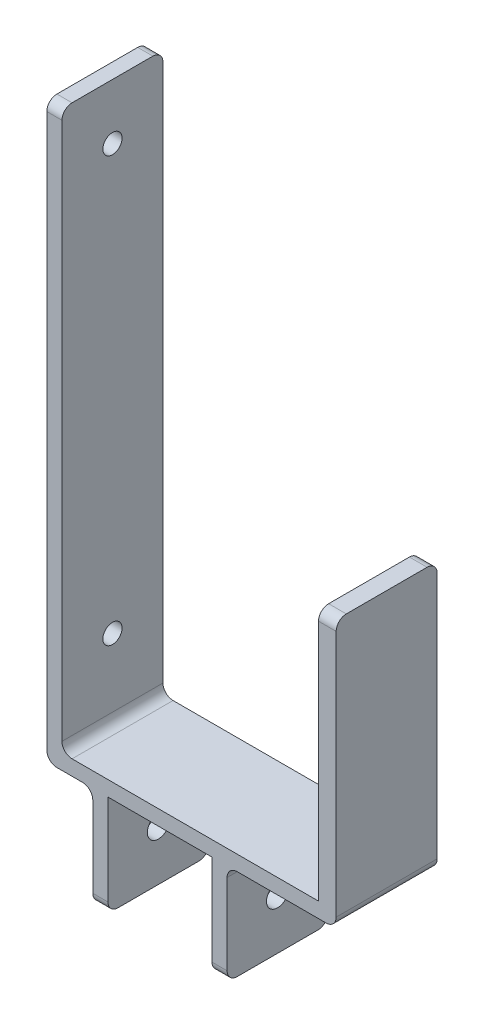
ISO-10303-21;
HEADER;
FILE_DESCRIPTION(('STEP AP214'),'2;1');
FILE_NAME('part.step','',(''),(''),'','','');
FILE_SCHEMA(('AUTOMOTIVE_DESIGN { 1 0 10303 214 1 1 1 1 }'));
ENDSEC;
DATA;
#1=APPLICATION_CONTEXT('core data for automotive mechanical design processes');
#2=APPLICATION_PROTOCOL_DEFINITION('international standard','automotive_design',2000,#1);
#3=PRODUCT_CONTEXT('',#1,'mechanical');
#4=PRODUCT('Part','Part','',(#3));
#5=PRODUCT_RELATED_PRODUCT_CATEGORY('part','',(#4));
#6=PRODUCT_DEFINITION_FORMATION('','',#4);
#7=PRODUCT_DEFINITION_CONTEXT('part definition',#1,'design');
#8=PRODUCT_DEFINITION('design','',#6,#7);
#9=PRODUCT_DEFINITION_SHAPE('','',#8);
#10=(LENGTH_UNIT() NAMED_UNIT(*) SI_UNIT(.MILLI.,.METRE.));
#11=(NAMED_UNIT(*) PLANE_ANGLE_UNIT() SI_UNIT($,.RADIAN.));
#12=(NAMED_UNIT(*) SI_UNIT($,.STERADIAN.) SOLID_ANGLE_UNIT());
#13=UNCERTAINTY_MEASURE_WITH_UNIT(LENGTH_MEASURE(1.E-05),#10,'distance_accuracy_value','');
#14=(GEOMETRIC_REPRESENTATION_CONTEXT(3) GLOBAL_UNCERTAINTY_ASSIGNED_CONTEXT((#13)) GLOBAL_UNIT_ASSIGNED_CONTEXT((#10,
#11,#12)) REPRESENTATION_CONTEXT('',''));
#15=CARTESIAN_POINT('',(0.,0.,0.));
#16=DIRECTION('',(0.,0.,1.));
#17=DIRECTION('',(1.,0.,0.));
#18=AXIS2_PLACEMENT_3D('',#15,#16,#17);
#19=CARTESIAN_POINT('',(-25.4,110.5,20.));
#20=DIRECTION('',(-1.,0.,0.));
#21=DIRECTION('',(0.,-1.,0.));
#22=AXIS2_PLACEMENT_3D('',#19,#20,#21);
#23=PLANE('',#22);
#24=CARTESIAN_POINT('',(-25.4,15.5,10.));
#25=DIRECTION('',(-1.,0.,0.));
#26=DIRECTION('',(0.,-1.,0.));
#27=AXIS2_PLACEMENT_3D('',#24,#25,#26);
#28=CIRCLE('',#27,1.9);
#29=CARTESIAN_POINT('',(-25.4,13.6,10.));
#30=VERTEX_POINT('',#29);
#31=EDGE_CURVE('E630',#30,#30,#28,.T.);
#32=ORIENTED_EDGE('',*,*,#31,.T.);
#33=EDGE_LOOP('',(#32));
#34=FACE_BOUND('',#33,.T.);
#35=CARTESIAN_POINT('',(-25.4,99.5,10.));
#36=DIRECTION('',(-1.,0.,0.));
#37=DIRECTION('',(0.,-1.,0.));
#38=AXIS2_PLACEMENT_3D('',#35,#36,#37);
#39=CIRCLE('',#38,1.9);
#40=CARTESIAN_POINT('',(-25.4,97.6,10.));
#41=VERTEX_POINT('',#40);
#42=EDGE_CURVE('E276',#41,#41,#39,.T.);
#43=ORIENTED_EDGE('',*,*,#42,.T.);
#44=EDGE_LOOP('',(#43));
#45=FACE_BOUND('',#44,.T.);
#46=DIRECTION('',(0.,1.,0.));
#47=VECTOR('',#46,1.);
#48=CARTESIAN_POINT('',(-25.4,110.5,20.));
#49=LINE('',#48,#47);
#50=CARTESIAN_POINT('',(-25.4,2.,20.));
#51=VERTEX_POINT('',#50);
#52=CARTESIAN_POINT('',(-25.4,108.5,20.));
#53=VERTEX_POINT('',#52);
#54=EDGE_CURVE('E305',#51,#53,#49,.T.);
#55=ORIENTED_EDGE('',*,*,#54,.F.);
#56=DIRECTION('',(0.,0.,-1.));
#57=VECTOR('',#56,1.);
#58=CARTESIAN_POINT('',(-25.4,2.,0.));
#59=LINE('',#58,#57);
#60=CARTESIAN_POINT('',(-25.4,2.,0.));
#61=VERTEX_POINT('',#60);
#62=EDGE_CURVE('E414',#51,#61,#59,.T.);
#63=ORIENTED_EDGE('',*,*,#62,.T.);
#64=DIRECTION('',(0.,1.,0.));
#65=VECTOR('',#64,1.);
#66=CARTESIAN_POINT('',(-25.4,110.5,0.));
#67=LINE('',#66,#65);
#68=CARTESIAN_POINT('',(-25.4,108.5,0.));
#69=VERTEX_POINT('',#68);
#70=EDGE_CURVE('E272',#61,#69,#67,.T.);
#71=ORIENTED_EDGE('',*,*,#70,.T.);
#72=CARTESIAN_POINT('',(-25.4,108.5,2.));
#73=DIRECTION('',(-1.,0.,0.));
#74=DIRECTION('',(0.,-1.,0.));
#75=AXIS2_PLACEMENT_3D('',#72,#73,#74);
#76=CIRCLE('',#75,2.);
#77=CARTESIAN_POINT('',(-25.4,110.5,2.));
#78=VERTEX_POINT('',#77);
#79=EDGE_CURVE('E412',#69,#78,#76,.F.);
#80=ORIENTED_EDGE('',*,*,#79,.T.);
#81=DIRECTION('',(0.,0.,-1.));
#82=VECTOR('',#81,1.);
#83=CARTESIAN_POINT('',(-25.4,110.5,20.));
#84=LINE('',#83,#82);
#85=CARTESIAN_POINT('',(-25.4,110.5,18.));
#86=VERTEX_POINT('',#85);
#87=EDGE_CURVE('E327',#86,#78,#84,.T.);
#88=ORIENTED_EDGE('',*,*,#87,.F.);
#89=CARTESIAN_POINT('',(-25.4,108.5,18.));
#90=DIRECTION('',(-1.,0.,0.));
#91=DIRECTION('',(0.,-1.,0.));
#92=AXIS2_PLACEMENT_3D('',#89,#90,#91);
#93=CIRCLE('',#92,2.);
#94=EDGE_CURVE('E410',#86,#53,#93,.F.);
#95=ORIENTED_EDGE('',*,*,#94,.T.);
#96=EDGE_LOOP('',(#55,#63,#71,#80,#88,#95));
#97=FACE_BOUND('',#96,.T.);
#98=ADVANCED_FACE('F32',(#34,#45,#97),#23,.F.);
#99=CARTESIAN_POINT('',(-28.4,110.5,20.));
#100=DIRECTION('',(0.,-1.,0.));
#101=DIRECTION('',(0.,0.,-1.));
#102=AXIS2_PLACEMENT_3D('',#99,#100,#101);
#103=PLANE('',#102);
#104=ORIENTED_EDGE('',*,*,#87,.T.);
#105=DIRECTION('',(-1.,0.,0.));
#106=VECTOR('',#105,1.);
#107=CARTESIAN_POINT('',(-28.4,110.5,2.));
#108=LINE('',#107,#106);
#109=CARTESIAN_POINT('',(-28.4,110.5,2.));
#110=VERTEX_POINT('',#109);
#111=EDGE_CURVE('E427',#78,#110,#108,.T.);
#112=ORIENTED_EDGE('',*,*,#111,.T.);
#113=DIRECTION('',(0.,0.,-1.));
#114=VECTOR('',#113,1.);
#115=CARTESIAN_POINT('',(-28.4,110.5,20.));
#116=LINE('',#115,#114);
#117=CARTESIAN_POINT('',(-28.4,110.5,18.));
#118=VERTEX_POINT('',#117);
#119=EDGE_CURVE('E324',#118,#110,#116,.T.);
#120=ORIENTED_EDGE('',*,*,#119,.F.);
#121=DIRECTION('',(-1.,0.,0.));
#122=VECTOR('',#121,1.);
#123=CARTESIAN_POINT('',(-25.4,110.5,18.));
#124=LINE('',#123,#122);
#125=EDGE_CURVE('E425',#118,#86,#124,.F.);
#126=ORIENTED_EDGE('',*,*,#125,.T.);
#127=EDGE_LOOP('',(#104,#112,#120,#126));
#128=FACE_BOUND('',#127,.T.);
#129=ADVANCED_FACE('F544',(#128),#103,.F.);
#130=CARTESIAN_POINT('',(-28.4,-3.00000000000001,20.));
#131=DIRECTION('',(1.,0.,0.));
#132=DIRECTION('',(0.,1.,0.));
#133=AXIS2_PLACEMENT_3D('',#130,#131,#132);
#134=PLANE('',#133);
#135=CARTESIAN_POINT('',(-28.4,15.5,10.));
#136=DIRECTION('',(-1.,0.,0.));
#137=DIRECTION('',(0.,-1.,0.));
#138=AXIS2_PLACEMENT_3D('',#135,#136,#137);
#139=CIRCLE('',#138,1.9);
#140=CARTESIAN_POINT('',(-28.4,13.6,10.));
#141=VERTEX_POINT('',#140);
#142=EDGE_CURVE('E625',#141,#141,#139,.T.);
#143=ORIENTED_EDGE('',*,*,#142,.F.);
#144=EDGE_LOOP('',(#143));
#145=FACE_BOUND('',#144,.T.);
#146=CARTESIAN_POINT('',(-28.4,99.5,10.));
#147=DIRECTION('',(-1.,0.,0.));
#148=DIRECTION('',(0.,-1.,0.));
#149=AXIS2_PLACEMENT_3D('',#146,#147,#148);
#150=CIRCLE('',#149,1.9);
#151=CARTESIAN_POINT('',(-28.4,97.6,10.));
#152=VERTEX_POINT('',#151);
#153=EDGE_CURVE('E628',#152,#152,#150,.T.);
#154=ORIENTED_EDGE('',*,*,#153,.F.);
#155=EDGE_LOOP('',(#154));
#156=FACE_BOUND('',#155,.T.);
#157=DIRECTION('',(0.,-1.,0.));
#158=VECTOR('',#157,1.);
#159=CARTESIAN_POINT('',(-28.4,-3.00000000000001,0.));
#160=LINE('',#159,#158);
#161=CARTESIAN_POINT('',(-28.4,108.5,0.));
#162=VERTEX_POINT('',#161);
#163=CARTESIAN_POINT('',(-28.4,-1.00000000000001,0.));
#164=VERTEX_POINT('',#163);
#165=EDGE_CURVE('E275',#162,#164,#160,.T.);
#166=ORIENTED_EDGE('',*,*,#165,.T.);
#167=DIRECTION('',(0.,0.,-1.));
#168=VECTOR('',#167,1.);
#169=CARTESIAN_POINT('',(-28.4,-1.00000000000001,20.));
#170=LINE('',#169,#168);
#171=CARTESIAN_POINT('',(-28.4,-1.00000000000001,20.));
#172=VERTEX_POINT('',#171);
#173=EDGE_CURVE('E408',#164,#172,#170,.F.);
#174=ORIENTED_EDGE('',*,*,#173,.T.);
#175=DIRECTION('',(0.,-1.,0.));
#176=VECTOR('',#175,1.);
#177=CARTESIAN_POINT('',(-28.4,-3.00000000000001,20.));
#178=LINE('',#177,#176);
#179=CARTESIAN_POINT('',(-28.4,108.5,20.));
#180=VERTEX_POINT('',#179);
#181=EDGE_CURVE('E459',#180,#172,#178,.T.);
#182=ORIENTED_EDGE('',*,*,#181,.F.);
#183=CARTESIAN_POINT('',(-28.4,108.5,18.));
#184=DIRECTION('',(1.,0.,0.));
#185=DIRECTION('',(0.,1.,0.));
#186=AXIS2_PLACEMENT_3D('',#183,#184,#185);
#187=CIRCLE('',#186,2.);
#188=EDGE_CURVE('E404',#180,#118,#187,.F.);
#189=ORIENTED_EDGE('',*,*,#188,.T.);
#190=ORIENTED_EDGE('',*,*,#119,.T.);
#191=CARTESIAN_POINT('',(-28.4,108.5,2.));
#192=DIRECTION('',(1.,0.,0.));
#193=DIRECTION('',(0.,1.,0.));
#194=AXIS2_PLACEMENT_3D('',#191,#192,#193);
#195=CIRCLE('',#194,2.);
#196=EDGE_CURVE('E406',#110,#162,#195,.F.);
#197=ORIENTED_EDGE('',*,*,#196,.T.);
#198=EDGE_LOOP('',(#166,#174,#182,#189,#190,#197));
#199=FACE_BOUND('',#198,.T.);
#200=ADVANCED_FACE('F550',(#145,#156,#199),#134,.F.);
#201=CARTESIAN_POINT('',(-19.3,-3.00000000000001,20.));
#202=DIRECTION('',(0.,1.,0.));
#203=DIRECTION('',(-1.,0.,0.));
#204=AXIS2_PLACEMENT_3D('',#201,#202,#203);
#205=PLANE('',#204);
#206=DIRECTION('',(1.,0.,0.));
#207=VECTOR('',#206,1.);
#208=CARTESIAN_POINT('',(-19.3,-3.00000000000001,0.));
#209=LINE('',#208,#207);
#210=CARTESIAN_POINT('',(-26.4,-3.00000000000001,0.));
#211=VERTEX_POINT('',#210);
#212=CARTESIAN_POINT('',(-21.3,-3.00000000000001,0.));
#213=VERTEX_POINT('',#212);
#214=EDGE_CURVE('E279',#211,#213,#209,.T.);
#215=ORIENTED_EDGE('',*,*,#214,.T.);
#216=DIRECTION('',(0.,0.,-1.));
#217=VECTOR('',#216,1.);
#218=CARTESIAN_POINT('',(-21.3,-3.00000000000001,20.));
#219=LINE('',#218,#217);
#220=CARTESIAN_POINT('',(-21.3,-3.00000000000001,20.));
#221=VERTEX_POINT('',#220);
#222=EDGE_CURVE('E390',#213,#221,#219,.F.);
#223=ORIENTED_EDGE('',*,*,#222,.T.);
#224=DIRECTION('',(1.,0.,0.));
#225=VECTOR('',#224,1.);
#226=CARTESIAN_POINT('',(-19.3,-3.00000000000001,20.));
#227=LINE('',#226,#225);
#228=CARTESIAN_POINT('',(-26.4,-3.00000000000001,20.));
#229=VERTEX_POINT('',#228);
#230=EDGE_CURVE('E462',#229,#221,#227,.T.);
#231=ORIENTED_EDGE('',*,*,#230,.F.);
#232=DIRECTION('',(0.,0.,-1.));
#233=VECTOR('',#232,1.);
#234=CARTESIAN_POINT('',(-26.4,-3.00000000000001,20.));
#235=LINE('',#234,#233);
#236=EDGE_CURVE('E387',#229,#211,#235,.T.);
#237=ORIENTED_EDGE('',*,*,#236,.T.);
#238=EDGE_LOOP('',(#215,#223,#231,#237));
#239=FACE_BOUND('',#238,.T.);
#240=ADVANCED_FACE('F603',(#239),#205,.F.);
#241=CARTESIAN_POINT('',(-19.3,-3.00000000000001,20.));
#242=DIRECTION('',(1.,0.,0.));
#243=DIRECTION('',(0.,1.,0.));
#244=AXIS2_PLACEMENT_3D('',#241,#242,#243);
#245=PLANE('',#244);
#246=CARTESIAN_POINT('',(-19.3,-13.,10.));
#247=DIRECTION('',(1.,0.,0.));
#248=DIRECTION('',(0.,1.,0.));
#249=AXIS2_PLACEMENT_3D('',#246,#247,#248);
#250=CIRCLE('',#249,2.2);
#251=CARTESIAN_POINT('',(-19.3,-10.8,10.));
#252=VERTEX_POINT('',#251);
#253=EDGE_CURVE('E635',#252,#252,#250,.T.);
#254=ORIENTED_EDGE('',*,*,#253,.T.);
#255=EDGE_LOOP('',(#254));
#256=FACE_BOUND('',#255,.T.);
#257=DIRECTION('',(0.,-1.,0.));
#258=VECTOR('',#257,1.);
#259=CARTESIAN_POINT('',(-19.3,-3.00000000000001,0.));
#260=LINE('',#259,#258);
#261=CARTESIAN_POINT('',(-19.3,-5.00000000000001,0.));
#262=VERTEX_POINT('',#261);
#263=CARTESIAN_POINT('',(-19.3,-21.,0.));
#264=VERTEX_POINT('',#263);
#265=EDGE_CURVE('E282',#262,#264,#260,.T.);
#266=ORIENTED_EDGE('',*,*,#265,.T.);
#267=CARTESIAN_POINT('',(-19.3,-21.,2.));
#268=DIRECTION('',(1.,0.,0.));
#269=DIRECTION('',(0.,1.,0.));
#270=AXIS2_PLACEMENT_3D('',#267,#268,#269);
#271=CIRCLE('',#270,2.);
#272=CARTESIAN_POINT('',(-19.3,-23.,2.));
#273=VERTEX_POINT('',#272);
#274=EDGE_CURVE('E385',#264,#273,#271,.F.);
#275=ORIENTED_EDGE('',*,*,#274,.T.);
#276=DIRECTION('',(0.,0.,-1.));
#277=VECTOR('',#276,1.);
#278=CARTESIAN_POINT('',(-19.3,-23.,20.));
#279=LINE('',#278,#277);
#280=CARTESIAN_POINT('',(-19.3,-23.,18.));
#281=VERTEX_POINT('',#280);
#282=EDGE_CURVE('E321',#281,#273,#279,.T.);
#283=ORIENTED_EDGE('',*,*,#282,.F.);
#284=CARTESIAN_POINT('',(-19.3,-21.,18.));
#285=DIRECTION('',(1.,0.,0.));
#286=DIRECTION('',(0.,1.,0.));
#287=AXIS2_PLACEMENT_3D('',#284,#285,#286);
#288=CIRCLE('',#287,2.);
#289=CARTESIAN_POINT('',(-19.3,-21.,20.));
#290=VERTEX_POINT('',#289);
#291=EDGE_CURVE('E383',#281,#290,#288,.F.);
#292=ORIENTED_EDGE('',*,*,#291,.T.);
#293=DIRECTION('',(0.,-1.,0.));
#294=VECTOR('',#293,1.);
#295=CARTESIAN_POINT('',(-19.3,-3.00000000000001,20.));
#296=LINE('',#295,#294);
#297=CARTESIAN_POINT('',(-19.3,-5.00000000000001,20.));
#298=VERTEX_POINT('',#297);
#299=EDGE_CURVE('E236',#298,#290,#296,.T.);
#300=ORIENTED_EDGE('',*,*,#299,.F.);
#301=DIRECTION('',(0.,0.,-1.));
#302=VECTOR('',#301,1.);
#303=CARTESIAN_POINT('',(-19.3,-5.00000000000001,0.));
#304=LINE('',#303,#302);
#305=EDGE_CURVE('E380',#298,#262,#304,.T.);
#306=ORIENTED_EDGE('',*,*,#305,.T.);
#307=EDGE_LOOP('',(#266,#275,#283,#292,#300,#306));
#308=FACE_BOUND('',#307,.T.);
#309=ADVANCED_FACE('F606',(#256,#308),#245,.F.);
#310=CARTESIAN_POINT('',(-19.3,-23.,20.));
#311=DIRECTION('',(0.,1.,0.));
#312=DIRECTION('',(-1.,0.,0.));
#313=AXIS2_PLACEMENT_3D('',#310,#311,#312);
#314=PLANE('',#313);
#315=ORIENTED_EDGE('',*,*,#282,.T.);
#316=DIRECTION('',(1.,0.,0.));
#317=VECTOR('',#316,1.);
#318=CARTESIAN_POINT('',(-19.3,-23.,2.));
#319=LINE('',#318,#317);
#320=CARTESIAN_POINT('',(-16.3,-23.,2.));
#321=VERTEX_POINT('',#320);
#322=EDGE_CURVE('E373',#273,#321,#319,.T.);
#323=ORIENTED_EDGE('',*,*,#322,.T.);
#324=DIRECTION('',(0.,0.,-1.));
#325=VECTOR('',#324,1.);
#326=CARTESIAN_POINT('',(-16.3,-23.,20.));
#327=LINE('',#326,#325);
#328=CARTESIAN_POINT('',(-16.3,-23.,18.));
#329=VERTEX_POINT('',#328);
#330=EDGE_CURVE('E246',#329,#321,#327,.T.);
#331=ORIENTED_EDGE('',*,*,#330,.F.);
#332=DIRECTION('',(1.,0.,0.));
#333=VECTOR('',#332,1.);
#334=CARTESIAN_POINT('',(-19.3,-23.,18.));
#335=LINE('',#334,#333);
#336=EDGE_CURVE('E371',#329,#281,#335,.F.);
#337=ORIENTED_EDGE('',*,*,#336,.T.);
#338=EDGE_LOOP('',(#315,#323,#331,#337));
#339=FACE_BOUND('',#338,.T.);
#340=ADVANCED_FACE('F478',(#339),#314,.F.);
#341=CARTESIAN_POINT('',(-16.3,-23.,20.));
#342=DIRECTION('',(-1.,0.,0.));
#343=DIRECTION('',(0.,-1.,0.));
#344=AXIS2_PLACEMENT_3D('',#341,#342,#343);
#345=PLANE('',#344);
#346=CARTESIAN_POINT('',(-16.3,-13.,10.));
#347=DIRECTION('',(-1.,0.,0.));
#348=DIRECTION('',(0.,-1.,0.));
#349=AXIS2_PLACEMENT_3D('',#346,#347,#348);
#350=CIRCLE('',#349,2.2);
#351=CARTESIAN_POINT('',(-16.3,-15.2,10.));
#352=VERTEX_POINT('',#351);
#353=EDGE_CURVE('E637',#352,#352,#350,.T.);
#354=ORIENTED_EDGE('',*,*,#353,.T.);
#355=EDGE_LOOP('',(#354));
#356=FACE_BOUND('',#355,.T.);
#357=ORIENTED_EDGE('',*,*,#330,.T.);
#358=CARTESIAN_POINT('',(-16.3,-21.,2.));
#359=DIRECTION('',(-1.,0.,0.));
#360=DIRECTION('',(0.,-1.,0.));
#361=AXIS2_PLACEMENT_3D('',#358,#359,#360);
#362=CIRCLE('',#361,2.);
#363=CARTESIAN_POINT('',(-16.3,-21.,0.));
#364=VERTEX_POINT('',#363);
#365=EDGE_CURVE('E378',#321,#364,#362,.F.);
#366=ORIENTED_EDGE('',*,*,#365,.T.);
#367=DIRECTION('',(0.,1.,0.));
#368=VECTOR('',#367,1.);
#369=CARTESIAN_POINT('',(-16.3,-23.,0.));
#370=LINE('',#369,#368);
#371=CARTESIAN_POINT('',(-16.3,-3.00000000000001,0.));
#372=VERTEX_POINT('',#371);
#373=EDGE_CURVE('E243',#364,#372,#370,.T.);
#374=ORIENTED_EDGE('',*,*,#373,.T.);
#375=DIRECTION('',(0.,0.,-1.));
#376=VECTOR('',#375,1.);
#377=CARTESIAN_POINT('',(-16.3,-3.00000000000001,20.));
#378=LINE('',#377,#376);
#379=CARTESIAN_POINT('',(-16.3,-3.00000000000001,20.));
#380=VERTEX_POINT('',#379);
#381=EDGE_CURVE('E239',#380,#372,#378,.T.);
#382=ORIENTED_EDGE('',*,*,#381,.F.);
#383=DIRECTION('',(0.,1.,0.));
#384=VECTOR('',#383,1.);
#385=CARTESIAN_POINT('',(-16.3,-23.,20.));
#386=LINE('',#385,#384);
#387=CARTESIAN_POINT('',(-16.3,-21.,20.));
#388=VERTEX_POINT('',#387);
#389=EDGE_CURVE('E225',#388,#380,#386,.T.);
#390=ORIENTED_EDGE('',*,*,#389,.F.);
#391=CARTESIAN_POINT('',(-16.3,-21.,18.));
#392=DIRECTION('',(-1.,0.,0.));
#393=DIRECTION('',(0.,-1.,0.));
#394=AXIS2_PLACEMENT_3D('',#391,#392,#393);
#395=CIRCLE('',#394,2.);
#396=EDGE_CURVE('E376',#388,#329,#395,.F.);
#397=ORIENTED_EDGE('',*,*,#396,.T.);
#398=EDGE_LOOP('',(#357,#366,#374,#382,#390,#397));
#399=FACE_BOUND('',#398,.T.);
#400=ADVANCED_FACE('F241',(#356,#399),#345,.F.);
#401=CARTESIAN_POINT('',(4.30000000000003,-3.,20.));
#402=DIRECTION('',(0.,1.,0.));
#403=DIRECTION('',(-1.,0.,0.));
#404=AXIS2_PLACEMENT_3D('',#401,#402,#403);
#405=PLANE('',#404);
#406=DIRECTION('',(1.,0.,0.));
#407=VECTOR('',#406,1.);
#408=CARTESIAN_POINT('',(4.30000000000003,-3.,0.));
#409=LINE('',#408,#407);
#410=CARTESIAN_POINT('',(4.30000000000003,-3.,0.));
#411=VERTEX_POINT('',#410);
#412=EDGE_CURVE('E286',#372,#411,#409,.T.);
#413=ORIENTED_EDGE('',*,*,#412,.T.);
#414=DIRECTION('',(0.,0.,-1.));
#415=VECTOR('',#414,1.);
#416=CARTESIAN_POINT('',(4.30000000000003,-3.,20.));
#417=LINE('',#416,#415);
#418=CARTESIAN_POINT('',(4.30000000000003,-3.,20.));
#419=VERTEX_POINT('',#418);
#420=EDGE_CURVE('E247',#419,#411,#417,.T.);
#421=ORIENTED_EDGE('',*,*,#420,.F.);
#422=DIRECTION('',(1.,0.,0.));
#423=VECTOR('',#422,1.);
#424=CARTESIAN_POINT('',(4.30000000000003,-3.,20.));
#425=LINE('',#424,#423);
#426=EDGE_CURVE('E230',#380,#419,#425,.T.);
#427=ORIENTED_EDGE('',*,*,#426,.F.);
#428=ORIENTED_EDGE('',*,*,#381,.T.);
#429=EDGE_LOOP('',(#413,#421,#427,#428));
#430=FACE_BOUND('',#429,.T.);
#431=ADVANCED_FACE('F249',(#430),#405,.F.);
#432=CARTESIAN_POINT('',(4.30000000000003,-3.,20.));
#433=DIRECTION('',(1.,0.,0.));
#434=DIRECTION('',(0.,1.,0.));
#435=AXIS2_PLACEMENT_3D('',#432,#433,#434);
#436=PLANE('',#435);
#437=CARTESIAN_POINT('',(4.30000000000001,-13.,10.));
#438=DIRECTION('',(1.,0.,0.));
#439=DIRECTION('',(0.,1.,0.));
#440=AXIS2_PLACEMENT_3D('',#437,#438,#439);
#441=CIRCLE('',#440,2.2);
#442=CARTESIAN_POINT('',(4.30000000000002,-10.8,10.));
#443=VERTEX_POINT('',#442);
#444=EDGE_CURVE('E640',#443,#443,#441,.T.);
#445=ORIENTED_EDGE('',*,*,#444,.T.);
#446=EDGE_LOOP('',(#445));
#447=FACE_BOUND('',#446,.T.);
#448=DIRECTION('',(0.,0.,-1.));
#449=VECTOR('',#448,1.);
#450=CARTESIAN_POINT('',(4.3,-23.,20.));
#451=LINE('',#450,#449);
#452=CARTESIAN_POINT('',(4.3,-23.,18.));
#453=VERTEX_POINT('',#452);
#454=CARTESIAN_POINT('',(4.3,-23.,2.));
#455=VERTEX_POINT('',#454);
#456=EDGE_CURVE('E316',#453,#455,#451,.T.);
#457=ORIENTED_EDGE('',*,*,#456,.F.);
#458=CARTESIAN_POINT('',(4.30000000000001,-21.,18.));
#459=DIRECTION('',(1.,0.,0.));
#460=DIRECTION('',(0.,1.,0.));
#461=AXIS2_PLACEMENT_3D('',#458,#459,#460);
#462=CIRCLE('',#461,2.);
#463=CARTESIAN_POINT('',(4.30000000000001,-21.,20.));
#464=VERTEX_POINT('',#463);
#465=EDGE_CURVE('E357',#453,#464,#462,.F.);
#466=ORIENTED_EDGE('',*,*,#465,.T.);
#467=DIRECTION('',(0.,-1.,0.));
#468=VECTOR('',#467,1.);
#469=CARTESIAN_POINT('',(4.30000000000003,-3.,20.));
#470=LINE('',#469,#468);
#471=EDGE_CURVE('E252',#419,#464,#470,.T.);
#472=ORIENTED_EDGE('',*,*,#471,.F.);
#473=ORIENTED_EDGE('',*,*,#420,.T.);
#474=DIRECTION('',(0.,-1.,0.));
#475=VECTOR('',#474,1.);
#476=CARTESIAN_POINT('',(4.30000000000003,-3.,0.));
#477=LINE('',#476,#475);
#478=CARTESIAN_POINT('',(4.30000000000001,-21.,0.));
#479=VERTEX_POINT('',#478);
#480=EDGE_CURVE('E288',#411,#479,#477,.T.);
#481=ORIENTED_EDGE('',*,*,#480,.T.);
#482=CARTESIAN_POINT('',(4.30000000000001,-21.,2.));
#483=DIRECTION('',(1.,0.,0.));
#484=DIRECTION('',(0.,1.,0.));
#485=AXIS2_PLACEMENT_3D('',#482,#483,#484);
#486=CIRCLE('',#485,2.);
#487=EDGE_CURVE('E355',#479,#455,#486,.F.);
#488=ORIENTED_EDGE('',*,*,#487,.T.);
#489=EDGE_LOOP('',(#457,#466,#472,#473,#481,#488));
#490=FACE_BOUND('',#489,.T.);
#491=ADVANCED_FACE('F489',(#447,#490),#436,.F.);
#492=CARTESIAN_POINT('',(4.3,-23.,20.));
#493=DIRECTION('',(0.,1.,0.));
#494=DIRECTION('',(0.,0.,1.));
#495=AXIS2_PLACEMENT_3D('',#492,#493,#494);
#496=PLANE('',#495);
#497=DIRECTION('',(0.,0.,-1.));
#498=VECTOR('',#497,1.);
#499=CARTESIAN_POINT('',(7.3,-23.,20.));
#500=LINE('',#499,#498);
#501=CARTESIAN_POINT('',(7.3,-23.,18.));
#502=VERTEX_POINT('',#501);
#503=CARTESIAN_POINT('',(7.3,-23.,2.));
#504=VERTEX_POINT('',#503);
#505=EDGE_CURVE('E313',#502,#504,#500,.T.);
#506=ORIENTED_EDGE('',*,*,#505,.F.);
#507=DIRECTION('',(1.,0.,0.));
#508=VECTOR('',#507,1.);
#509=CARTESIAN_POINT('',(4.3,-23.,18.));
#510=LINE('',#509,#508);
#511=EDGE_CURVE('E353',#502,#453,#510,.F.);
#512=ORIENTED_EDGE('',*,*,#511,.T.);
#513=ORIENTED_EDGE('',*,*,#456,.T.);
#514=DIRECTION('',(1.,0.,0.));
#515=VECTOR('',#514,1.);
#516=CARTESIAN_POINT('',(4.3,-23.,2.));
#517=LINE('',#516,#515);
#518=EDGE_CURVE('E350',#455,#504,#517,.T.);
#519=ORIENTED_EDGE('',*,*,#518,.T.);
#520=EDGE_LOOP('',(#506,#512,#513,#519));
#521=FACE_BOUND('',#520,.T.);
#522=ADVANCED_FACE('F501',(#521),#496,.F.);
#523=CARTESIAN_POINT('',(7.3,-23.,20.));
#524=DIRECTION('',(-1.,0.,0.));
#525=DIRECTION('',(0.,-1.,0.));
#526=AXIS2_PLACEMENT_3D('',#523,#524,#525);
#527=PLANE('',#526);
#528=CARTESIAN_POINT('',(7.30000000000001,-13.,10.));
#529=DIRECTION('',(-1.,0.,0.));
#530=DIRECTION('',(0.,-1.,0.));
#531=AXIS2_PLACEMENT_3D('',#528,#529,#530);
#532=CIRCLE('',#531,2.2);
#533=CARTESIAN_POINT('',(7.30000000000001,-15.2,10.));
#534=VERTEX_POINT('',#533);
#535=EDGE_CURVE('E36',#534,#534,#532,.T.);
#536=ORIENTED_EDGE('',*,*,#535,.T.);
#537=EDGE_LOOP('',(#536));
#538=FACE_BOUND('',#537,.T.);
#539=DIRECTION('',(0.,1.,0.));
#540=VECTOR('',#539,1.);
#541=CARTESIAN_POINT('',(7.3,-23.,20.));
#542=LINE('',#541,#540);
#543=CARTESIAN_POINT('',(7.3,-21.,20.));
#544=VERTEX_POINT('',#543);
#545=CARTESIAN_POINT('',(7.30000000000003,-5.,20.));
#546=VERTEX_POINT('',#545);
#547=EDGE_CURVE('E254',#544,#546,#542,.T.);
#548=ORIENTED_EDGE('',*,*,#547,.F.);
#549=CARTESIAN_POINT('',(7.3,-21.,18.));
#550=DIRECTION('',(-1.,0.,0.));
#551=DIRECTION('',(0.,-1.,0.));
#552=AXIS2_PLACEMENT_3D('',#549,#550,#551);
#553=CIRCLE('',#552,2.);
#554=EDGE_CURVE('E348',#544,#502,#553,.F.);
#555=ORIENTED_EDGE('',*,*,#554,.T.);
#556=ORIENTED_EDGE('',*,*,#505,.T.);
#557=CARTESIAN_POINT('',(7.3,-21.,2.));
#558=DIRECTION('',(-1.,0.,0.));
#559=DIRECTION('',(0.,-1.,0.));
#560=AXIS2_PLACEMENT_3D('',#557,#558,#559);
#561=CIRCLE('',#560,2.);
#562=CARTESIAN_POINT('',(7.3,-21.,0.));
#563=VERTEX_POINT('',#562);
#564=EDGE_CURVE('E346',#504,#563,#561,.F.);
#565=ORIENTED_EDGE('',*,*,#564,.T.);
#566=DIRECTION('',(0.,1.,0.));
#567=VECTOR('',#566,1.);
#568=CARTESIAN_POINT('',(7.3,-23.,0.));
#569=LINE('',#568,#567);
#570=CARTESIAN_POINT('',(7.30000000000003,-5.,0.));
#571=VERTEX_POINT('',#570);
#572=EDGE_CURVE('E291',#563,#571,#569,.T.);
#573=ORIENTED_EDGE('',*,*,#572,.T.);
#574=DIRECTION('',(0.,0.,-1.));
#575=VECTOR('',#574,1.);
#576=CARTESIAN_POINT('',(7.30000000000003,-5.,20.));
#577=LINE('',#576,#575);
#578=EDGE_CURVE('E344',#571,#546,#577,.F.);
#579=ORIENTED_EDGE('',*,*,#578,.T.);
#580=EDGE_LOOP('',(#548,#555,#556,#565,#573,#579));
#581=FACE_BOUND('',#580,.T.);
#582=ADVANCED_FACE('F499',(#538,#581),#527,.F.);
#583=CARTESIAN_POINT('',(28.9,-3.,20.));
#584=DIRECTION('',(0.,1.,0.));
#585=DIRECTION('',(0.,0.,1.));
#586=AXIS2_PLACEMENT_3D('',#583,#584,#585);
#587=PLANE('',#586);
#588=DIRECTION('',(1.,0.,0.));
#589=VECTOR('',#588,1.);
#590=CARTESIAN_POINT('',(28.9,-3.,20.));
#591=LINE('',#590,#589);
#592=CARTESIAN_POINT('',(9.30000000000003,-3.,20.));
#593=VERTEX_POINT('',#592);
#594=CARTESIAN_POINT('',(26.9,-3.,20.));
#595=VERTEX_POINT('',#594);
#596=EDGE_CURVE('E260',#593,#595,#591,.T.);
#597=ORIENTED_EDGE('',*,*,#596,.F.);
#598=DIRECTION('',(0.,0.,-1.));
#599=VECTOR('',#598,1.);
#600=CARTESIAN_POINT('',(9.30000000000003,-3.,0.));
#601=LINE('',#600,#599);
#602=CARTESIAN_POINT('',(9.30000000000003,-3.,0.));
#603=VERTEX_POINT('',#602);
#604=EDGE_CURVE('E394',#593,#603,#601,.T.);
#605=ORIENTED_EDGE('',*,*,#604,.T.);
#606=DIRECTION('',(1.,0.,0.));
#607=VECTOR('',#606,1.);
#608=CARTESIAN_POINT('',(28.9,-3.,0.));
#609=LINE('',#608,#607);
#610=CARTESIAN_POINT('',(26.9,-3.,0.));
#611=VERTEX_POINT('',#610);
#612=EDGE_CURVE('E294',#603,#611,#609,.T.);
#613=ORIENTED_EDGE('',*,*,#612,.T.);
#614=DIRECTION('',(0.,0.,-1.));
#615=VECTOR('',#614,1.);
#616=CARTESIAN_POINT('',(26.9,-3.,20.));
#617=LINE('',#616,#615);
#618=EDGE_CURVE('E392',#611,#595,#617,.F.);
#619=ORIENTED_EDGE('',*,*,#618,.T.);
#620=EDGE_LOOP('',(#597,#605,#613,#619));
#621=FACE_BOUND('',#620,.T.);
#622=ADVANCED_FACE('F514',(#621),#587,.F.);
#623=CARTESIAN_POINT('',(28.9,50.,20.));
#624=DIRECTION('',(-1.,0.,0.));
#625=DIRECTION('',(0.,-1.,0.));
#626=AXIS2_PLACEMENT_3D('',#623,#624,#625);
#627=PLANE('',#626);
#628=DIRECTION('',(0.,1.,0.));
#629=VECTOR('',#628,1.);
#630=CARTESIAN_POINT('',(28.9,50.,20.));
#631=LINE('',#630,#629);
#632=CARTESIAN_POINT('',(28.9,-1.,20.));
#633=VERTEX_POINT('',#632);
#634=CARTESIAN_POINT('',(28.9,48.,20.));
#635=VERTEX_POINT('',#634);
#636=EDGE_CURVE('E263',#633,#635,#631,.T.);
#637=ORIENTED_EDGE('',*,*,#636,.F.);
#638=DIRECTION('',(0.,0.,-1.));
#639=VECTOR('',#638,1.);
#640=CARTESIAN_POINT('',(28.9,-1.,20.));
#641=LINE('',#640,#639);
#642=CARTESIAN_POINT('',(28.9,-1.,0.));
#643=VERTEX_POINT('',#642);
#644=EDGE_CURVE('E401',#633,#643,#641,.T.);
#645=ORIENTED_EDGE('',*,*,#644,.T.);
#646=DIRECTION('',(0.,1.,0.));
#647=VECTOR('',#646,1.);
#648=CARTESIAN_POINT('',(28.9,50.,0.));
#649=LINE('',#648,#647);
#650=CARTESIAN_POINT('',(28.9,48.,0.));
#651=VERTEX_POINT('',#650);
#652=EDGE_CURVE('E297',#643,#651,#649,.T.);
#653=ORIENTED_EDGE('',*,*,#652,.T.);
#654=CARTESIAN_POINT('',(28.9,48.,2.));
#655=DIRECTION('',(-1.,0.,0.));
#656=DIRECTION('',(0.,-1.,0.));
#657=AXIS2_PLACEMENT_3D('',#654,#655,#656);
#658=CIRCLE('',#657,2.);
#659=CARTESIAN_POINT('',(28.9,50.,2.));
#660=VERTEX_POINT('',#659);
#661=EDGE_CURVE('E399',#651,#660,#658,.F.);
#662=ORIENTED_EDGE('',*,*,#661,.T.);
#663=DIRECTION('',(0.,0.,-1.));
#664=VECTOR('',#663,1.);
#665=CARTESIAN_POINT('',(28.9,50.,20.));
#666=LINE('',#665,#664);
#667=CARTESIAN_POINT('',(28.9,50.,18.));
#668=VERTEX_POINT('',#667);
#669=EDGE_CURVE('E310',#668,#660,#666,.T.);
#670=ORIENTED_EDGE('',*,*,#669,.F.);
#671=CARTESIAN_POINT('',(28.9,48.,18.));
#672=DIRECTION('',(-1.,0.,0.));
#673=DIRECTION('',(0.,-1.,0.));
#674=AXIS2_PLACEMENT_3D('',#671,#672,#673);
#675=CIRCLE('',#674,2.);
#676=EDGE_CURVE('E397',#668,#635,#675,.F.);
#677=ORIENTED_EDGE('',*,*,#676,.T.);
#678=EDGE_LOOP('',(#637,#645,#653,#662,#670,#677));
#679=FACE_BOUND('',#678,.T.);
#680=ADVANCED_FACE('F523',(#679),#627,.F.);
#681=CARTESIAN_POINT('',(25.4,50.,20.));
#682=DIRECTION('',(0.,-1.,0.));
#683=DIRECTION('',(0.,0.,-1.));
#684=AXIS2_PLACEMENT_3D('',#681,#682,#683);
#685=PLANE('',#684);
#686=ORIENTED_EDGE('',*,*,#669,.T.);
#687=DIRECTION('',(-1.,0.,0.));
#688=VECTOR('',#687,1.);
#689=CARTESIAN_POINT('',(25.4,50.,2.));
#690=LINE('',#689,#688);
#691=CARTESIAN_POINT('',(25.4,50.,2.));
#692=VERTEX_POINT('',#691);
#693=EDGE_CURVE('E421',#660,#692,#690,.T.);
#694=ORIENTED_EDGE('',*,*,#693,.T.);
#695=DIRECTION('',(0.,0.,-1.));
#696=VECTOR('',#695,1.);
#697=CARTESIAN_POINT('',(25.4,50.,20.));
#698=LINE('',#697,#696);
#699=CARTESIAN_POINT('',(25.4,50.,18.));
#700=VERTEX_POINT('',#699);
#701=EDGE_CURVE('E308',#700,#692,#698,.T.);
#702=ORIENTED_EDGE('',*,*,#701,.F.);
#703=DIRECTION('',(-1.,0.,0.));
#704=VECTOR('',#703,1.);
#705=CARTESIAN_POINT('',(28.9,50.,18.));
#706=LINE('',#705,#704);
#707=EDGE_CURVE('E419',#700,#668,#706,.F.);
#708=ORIENTED_EDGE('',*,*,#707,.T.);
#709=EDGE_LOOP('',(#686,#694,#702,#708));
#710=FACE_BOUND('',#709,.T.);
#711=ADVANCED_FACE('F529',(#710),#685,.F.);
#712=CARTESIAN_POINT('',(25.4,0.,20.));
#713=DIRECTION('',(1.,0.,0.));
#714=DIRECTION('',(0.,1.,0.));
#715=AXIS2_PLACEMENT_3D('',#712,#713,#714);
#716=PLANE('',#715);
#717=ORIENTED_EDGE('',*,*,#701,.T.);
#718=CARTESIAN_POINT('',(25.4,48.,2.));
#719=DIRECTION('',(1.,0.,0.));
#720=DIRECTION('',(0.,1.,0.));
#721=AXIS2_PLACEMENT_3D('',#718,#719,#720);
#722=CIRCLE('',#721,2.);
#723=CARTESIAN_POINT('',(25.4,48.,0.));
#724=VERTEX_POINT('',#723);
#725=EDGE_CURVE('E48',#692,#724,#722,.F.);
#726=ORIENTED_EDGE('',*,*,#725,.T.);
#727=DIRECTION('',(0.,-1.,0.));
#728=VECTOR('',#727,1.);
#729=CARTESIAN_POINT('',(25.4,0.,0.));
#730=LINE('',#729,#728);
#731=CARTESIAN_POINT('',(25.4,0.,0.));
#732=VERTEX_POINT('',#731);
#733=EDGE_CURVE('E300',#724,#732,#730,.T.);
#734=ORIENTED_EDGE('',*,*,#733,.T.);
#735=DIRECTION('',(0.,0.,-1.));
#736=VECTOR('',#735,1.);
#737=CARTESIAN_POINT('',(25.4,0.,20.));
#738=LINE('',#737,#736);
#739=CARTESIAN_POINT('',(25.4,0.,20.));
#740=VERTEX_POINT('',#739);
#741=EDGE_CURVE('E271',#740,#732,#738,.T.);
#742=ORIENTED_EDGE('',*,*,#741,.F.);
#743=DIRECTION('',(0.,-1.,0.));
#744=VECTOR('',#743,1.);
#745=CARTESIAN_POINT('',(25.4,0.,20.));
#746=LINE('',#745,#744);
#747=CARTESIAN_POINT('',(25.4,48.,20.));
#748=VERTEX_POINT('',#747);
#749=EDGE_CURVE('E266',#748,#740,#746,.T.);
#750=ORIENTED_EDGE('',*,*,#749,.F.);
#751=CARTESIAN_POINT('',(25.4,48.,18.));
#752=DIRECTION('',(1.,0.,0.));
#753=DIRECTION('',(0.,1.,0.));
#754=AXIS2_PLACEMENT_3D('',#751,#752,#753);
#755=CIRCLE('',#754,2.);
#756=EDGE_CURVE('E56',#748,#700,#755,.F.);
#757=ORIENTED_EDGE('',*,*,#756,.T.);
#758=EDGE_LOOP('',(#717,#726,#734,#742,#750,#757));
#759=FACE_BOUND('',#758,.T.);
#760=ADVANCED_FACE('F534',(#759),#716,.F.);
#761=CARTESIAN_POINT('',(-25.4,0.,20.));
#762=DIRECTION('',(0.,-1.,0.));
#763=DIRECTION('',(0.,0.,-1.));
#764=AXIS2_PLACEMENT_3D('',#761,#762,#763);
#765=PLANE('',#764);
#766=DIRECTION('',(-1.,0.,0.));
#767=VECTOR('',#766,1.);
#768=CARTESIAN_POINT('',(-25.4,0.,0.));
#769=LINE('',#768,#767);
#770=CARTESIAN_POINT('',(-23.4,0.,0.));
#771=VERTEX_POINT('',#770);
#772=EDGE_CURVE('E302',#732,#771,#769,.T.);
#773=ORIENTED_EDGE('',*,*,#772,.T.);
#774=DIRECTION('',(0.,0.,-1.));
#775=VECTOR('',#774,1.);
#776=CARTESIAN_POINT('',(-23.4,0.,20.));
#777=LINE('',#776,#775);
#778=CARTESIAN_POINT('',(-23.4,0.,20.));
#779=VERTEX_POINT('',#778);
#780=EDGE_CURVE('E417',#771,#779,#777,.F.);
#781=ORIENTED_EDGE('',*,*,#780,.T.);
#782=DIRECTION('',(-1.,0.,0.));
#783=VECTOR('',#782,1.);
#784=CARTESIAN_POINT('',(-25.4,0.,20.));
#785=LINE('',#784,#783);
#786=EDGE_CURVE('E268',#740,#779,#785,.T.);
#787=ORIENTED_EDGE('',*,*,#786,.F.);
#788=ORIENTED_EDGE('',*,*,#741,.T.);
#789=EDGE_LOOP('',(#773,#781,#787,#788));
#790=FACE_BOUND('',#789,.T.);
#791=ADVANCED_FACE('F448',(#790),#765,.F.);
#792=CARTESIAN_POINT('',(0.,0.,20.));
#793=DIRECTION('',(0.,0.,1.));
#794=DIRECTION('',(1.,0.,0.));
#795=AXIS2_PLACEMENT_3D('',#792,#793,#794);
#796=PLANE('',#795);
#797=ORIENTED_EDGE('',*,*,#471,.T.);
#798=DIRECTION('',(1.,0.,0.));
#799=VECTOR('',#798,1.);
#800=CARTESIAN_POINT('',(7.3,-21.,20.));
#801=LINE('',#800,#799);
#802=EDGE_CURVE('E341',#464,#544,#801,.T.);
#803=ORIENTED_EDGE('',*,*,#802,.T.);
#804=ORIENTED_EDGE('',*,*,#547,.T.);
#805=CARTESIAN_POINT('',(9.30000000000003,-5.,20.));
#806=DIRECTION('',(0.,0.,1.));
#807=DIRECTION('',(1.,0.,0.));
#808=AXIS2_PLACEMENT_3D('',#805,#806,#807);
#809=CIRCLE('',#808,2.);
#810=EDGE_CURVE('E436',#546,#593,#809,.F.);
#811=ORIENTED_EDGE('',*,*,#810,.T.);
#812=ORIENTED_EDGE('',*,*,#596,.T.);
#813=CARTESIAN_POINT('',(26.9,-1.,20.));
#814=DIRECTION('',(0.,0.,1.));
#815=DIRECTION('',(1.,0.,0.));
#816=AXIS2_PLACEMENT_3D('',#813,#814,#815);
#817=CIRCLE('',#816,2.);
#818=EDGE_CURVE('E338',#595,#633,#817,.T.);
#819=ORIENTED_EDGE('',*,*,#818,.T.);
#820=ORIENTED_EDGE('',*,*,#636,.T.);
#821=DIRECTION('',(-1.,0.,0.));
#822=VECTOR('',#821,1.);
#823=CARTESIAN_POINT('',(25.4,48.,20.));
#824=LINE('',#823,#822);
#825=EDGE_CURVE('E333',#635,#748,#824,.T.);
#826=ORIENTED_EDGE('',*,*,#825,.T.);
#827=ORIENTED_EDGE('',*,*,#749,.T.);
#828=ORIENTED_EDGE('',*,*,#786,.T.);
#829=CARTESIAN_POINT('',(-23.4,2.,20.));
#830=DIRECTION('',(0.,0.,1.));
#831=DIRECTION('',(1.,0.,0.));
#832=AXIS2_PLACEMENT_3D('',#829,#830,#831);
#833=CIRCLE('',#832,2.);
#834=EDGE_CURVE('E11',#779,#51,#833,.F.);
#835=ORIENTED_EDGE('',*,*,#834,.T.);
#836=ORIENTED_EDGE('',*,*,#54,.T.);
#837=DIRECTION('',(-1.,0.,0.));
#838=VECTOR('',#837,1.);
#839=CARTESIAN_POINT('',(-28.4,108.5,20.));
#840=LINE('',#839,#838);
#841=EDGE_CURVE('E330',#53,#180,#840,.T.);
#842=ORIENTED_EDGE('',*,*,#841,.T.);
#843=ORIENTED_EDGE('',*,*,#181,.T.);
#844=CARTESIAN_POINT('',(-26.4,-1.00000000000001,20.));
#845=DIRECTION('',(0.,0.,1.));
#846=DIRECTION('',(1.,0.,0.));
#847=AXIS2_PLACEMENT_3D('',#844,#845,#846);
#848=CIRCLE('',#847,2.);
#849=EDGE_CURVE('E336',#172,#229,#848,.T.);
#850=ORIENTED_EDGE('',*,*,#849,.T.);
#851=ORIENTED_EDGE('',*,*,#230,.T.);
#852=CARTESIAN_POINT('',(-21.3,-5.00000000000001,20.));
#853=DIRECTION('',(0.,0.,1.));
#854=DIRECTION('',(1.,0.,0.));
#855=AXIS2_PLACEMENT_3D('',#852,#853,#854);
#856=CIRCLE('',#855,2.);
#857=EDGE_CURVE('E432',#221,#298,#856,.F.);
#858=ORIENTED_EDGE('',*,*,#857,.T.);
#859=ORIENTED_EDGE('',*,*,#299,.T.);
#860=DIRECTION('',(1.,0.,0.));
#861=VECTOR('',#860,1.);
#862=CARTESIAN_POINT('',(-16.3,-21.,20.));
#863=LINE('',#862,#861);
#864=EDGE_CURVE('E234',#290,#388,#863,.T.);
#865=ORIENTED_EDGE('',*,*,#864,.T.);
#866=ORIENTED_EDGE('',*,*,#389,.T.);
#867=ORIENTED_EDGE('',*,*,#426,.T.);
#868=EDGE_LOOP('',(#797,#803,#804,#811,#812,#819,#820,#826,#827,#828,#835,#836,#842,#843,#850,
#851,#858,#859,#865,#866,#867));
#869=FACE_BOUND('',#868,.T.);
#870=ADVANCED_FACE('F228',(#869),#796,.T.);
#871=CARTESIAN_POINT('',(0.,0.,0.));
#872=DIRECTION('',(0.,0.,1.));
#873=DIRECTION('',(1.,0.,0.));
#874=AXIS2_PLACEMENT_3D('',#871,#872,#873);
#875=PLANE('',#874);
#876=ORIENTED_EDGE('',*,*,#572,.F.);
#877=DIRECTION('',(1.,0.,0.));
#878=VECTOR('',#877,1.);
#879=CARTESIAN_POINT('',(0.,-21.,0.));
#880=LINE('',#879,#878);
#881=EDGE_CURVE('E369',#563,#479,#880,.F.);
#882=ORIENTED_EDGE('',*,*,#881,.T.);
#883=ORIENTED_EDGE('',*,*,#480,.F.);
#884=ORIENTED_EDGE('',*,*,#412,.F.);
#885=ORIENTED_EDGE('',*,*,#373,.F.);
#886=DIRECTION('',(1.,0.,0.));
#887=VECTOR('',#886,1.);
#888=CARTESIAN_POINT('',(0.,-21.,0.));
#889=LINE('',#888,#887);
#890=EDGE_CURVE('E367',#364,#264,#889,.F.);
#891=ORIENTED_EDGE('',*,*,#890,.T.);
#892=ORIENTED_EDGE('',*,*,#265,.F.);
#893=CARTESIAN_POINT('',(-21.3,-5.00000000000001,0.));
#894=DIRECTION('',(0.,0.,1.));
#895=DIRECTION('',(1.,0.,0.));
#896=AXIS2_PLACEMENT_3D('',#893,#894,#895);
#897=CIRCLE('',#896,2.);
#898=EDGE_CURVE('E430',#262,#213,#897,.T.);
#899=ORIENTED_EDGE('',*,*,#898,.T.);
#900=ORIENTED_EDGE('',*,*,#214,.F.);
#901=CARTESIAN_POINT('',(-26.4,-1.00000000000001,0.));
#902=DIRECTION('',(0.,0.,1.));
#903=DIRECTION('',(1.,0.,0.));
#904=AXIS2_PLACEMENT_3D('',#901,#902,#903);
#905=CIRCLE('',#904,2.);
#906=EDGE_CURVE('E363',#211,#164,#905,.F.);
#907=ORIENTED_EDGE('',*,*,#906,.T.);
#908=ORIENTED_EDGE('',*,*,#165,.F.);
#909=DIRECTION('',(-1.,0.,0.));
#910=VECTOR('',#909,1.);
#911=CARTESIAN_POINT('',(0.,108.5,0.));
#912=LINE('',#911,#910);
#913=EDGE_CURVE('E359',#162,#69,#912,.F.);
#914=ORIENTED_EDGE('',*,*,#913,.T.);
#915=ORIENTED_EDGE('',*,*,#70,.F.);
#916=CARTESIAN_POINT('',(-23.4,2.,0.));
#917=DIRECTION('',(0.,0.,1.));
#918=DIRECTION('',(1.,0.,0.));
#919=AXIS2_PLACEMENT_3D('',#916,#917,#918);
#920=CIRCLE('',#919,2.);
#921=EDGE_CURVE('E41',#61,#771,#920,.T.);
#922=ORIENTED_EDGE('',*,*,#921,.T.);
#923=ORIENTED_EDGE('',*,*,#772,.F.);
#924=ORIENTED_EDGE('',*,*,#733,.F.);
#925=DIRECTION('',(-1.,0.,0.));
#926=VECTOR('',#925,1.);
#927=CARTESIAN_POINT('',(0.,48.,0.));
#928=LINE('',#927,#926);
#929=EDGE_CURVE('E361',#724,#651,#928,.F.);
#930=ORIENTED_EDGE('',*,*,#929,.T.);
#931=ORIENTED_EDGE('',*,*,#652,.F.);
#932=CARTESIAN_POINT('',(26.9,-1.,0.));
#933=DIRECTION('',(0.,0.,1.));
#934=DIRECTION('',(1.,0.,0.));
#935=AXIS2_PLACEMENT_3D('',#932,#933,#934);
#936=CIRCLE('',#935,2.);
#937=EDGE_CURVE('E365',#643,#611,#936,.F.);
#938=ORIENTED_EDGE('',*,*,#937,.T.);
#939=ORIENTED_EDGE('',*,*,#612,.F.);
#940=CARTESIAN_POINT('',(9.30000000000003,-5.,0.));
#941=DIRECTION('',(0.,0.,1.));
#942=DIRECTION('',(1.,0.,0.));
#943=AXIS2_PLACEMENT_3D('',#940,#941,#942);
#944=CIRCLE('',#943,2.);
#945=EDGE_CURVE('E434',#603,#571,#944,.T.);
#946=ORIENTED_EDGE('',*,*,#945,.T.);
#947=EDGE_LOOP('',(#876,#882,#883,#884,#885,#891,#892,#899,#900,#907,#908,#914,#915,#922,#923,
#924,#930,#931,#938,#939,#946));
#948=FACE_BOUND('',#947,.T.);
#949=ADVANCED_FACE('F442',(#948),#875,.F.);
#950=CARTESIAN_POINT('',(0.,-21.,18.));
#951=DIRECTION('',(-1.,0.,0.));
#952=DIRECTION('',(0.,0.,1.));
#953=AXIS2_PLACEMENT_3D('',#950,#951,#952);
#954=CYLINDRICAL_SURFACE('',#953,2.);
#955=ORIENTED_EDGE('',*,*,#465,.F.);
#956=ORIENTED_EDGE('',*,*,#511,.F.);
#957=ORIENTED_EDGE('',*,*,#554,.F.);
#958=ORIENTED_EDGE('',*,*,#802,.F.);
#959=EDGE_LOOP('',(#955,#956,#957,#958));
#960=FACE_BOUND('',#959,.T.);
#961=ADVANCED_FACE('F495',(#960),#954,.T.);
#962=CARTESIAN_POINT('',(4.3,-21.,2.));
#963=DIRECTION('',(1.,0.,0.));
#964=DIRECTION('',(0.,0.,-1.));
#965=AXIS2_PLACEMENT_3D('',#962,#963,#964);
#966=CYLINDRICAL_SURFACE('',#965,2.);
#967=ORIENTED_EDGE('',*,*,#487,.F.);
#968=ORIENTED_EDGE('',*,*,#881,.F.);
#969=ORIENTED_EDGE('',*,*,#564,.F.);
#970=ORIENTED_EDGE('',*,*,#518,.F.);
#971=EDGE_LOOP('',(#967,#968,#969,#970));
#972=FACE_BOUND('',#971,.T.);
#973=ADVANCED_FACE('F504',(#972),#966,.T.);
#974=CARTESIAN_POINT('',(-19.3,-21.,2.));
#975=DIRECTION('',(1.,0.,0.));
#976=DIRECTION('',(0.,1.,0.));
#977=AXIS2_PLACEMENT_3D('',#974,#975,#976);
#978=CYLINDRICAL_SURFACE('',#977,2.);
#979=ORIENTED_EDGE('',*,*,#274,.F.);
#980=ORIENTED_EDGE('',*,*,#890,.F.);
#981=ORIENTED_EDGE('',*,*,#365,.F.);
#982=ORIENTED_EDGE('',*,*,#322,.F.);
#983=EDGE_LOOP('',(#979,#980,#981,#982));
#984=FACE_BOUND('',#983,.T.);
#985=ADVANCED_FACE('F483',(#984),#978,.T.);
#986=CARTESIAN_POINT('',(0.,-21.,18.));
#987=DIRECTION('',(-1.,0.,0.));
#988=DIRECTION('',(0.,-1.,0.));
#989=AXIS2_PLACEMENT_3D('',#986,#987,#988);
#990=CYLINDRICAL_SURFACE('',#989,2.);
#991=ORIENTED_EDGE('',*,*,#291,.F.);
#992=ORIENTED_EDGE('',*,*,#336,.F.);
#993=ORIENTED_EDGE('',*,*,#396,.F.);
#994=ORIENTED_EDGE('',*,*,#864,.F.);
#995=EDGE_LOOP('',(#991,#992,#993,#994));
#996=FACE_BOUND('',#995,.T.);
#997=ADVANCED_FACE('F474',(#996),#990,.T.);
#998=CARTESIAN_POINT('',(-21.3,-5.00000000000001,20.));
#999=DIRECTION('',(0.,0.,1.));
#1000=DIRECTION('',(1.,0.,0.));
#1001=AXIS2_PLACEMENT_3D('',#998,#999,#1000);
#1002=CYLINDRICAL_SURFACE('',#1001,2.);
#1003=ORIENTED_EDGE('',*,*,#857,.F.);
#1004=ORIENTED_EDGE('',*,*,#222,.F.);
#1005=ORIENTED_EDGE('',*,*,#898,.F.);
#1006=ORIENTED_EDGE('',*,*,#305,.F.);
#1007=EDGE_LOOP('',(#1003,#1004,#1005,#1006));
#1008=FACE_BOUND('',#1007,.T.);
#1009=ADVANCED_FACE('F565',(#1008),#1002,.F.);
#1010=CARTESIAN_POINT('',(9.30000000000003,-5.,20.));
#1011=DIRECTION('',(0.,0.,1.));
#1012=DIRECTION('',(1.,0.,0.));
#1013=AXIS2_PLACEMENT_3D('',#1010,#1011,#1012);
#1014=CYLINDRICAL_SURFACE('',#1013,2.);
#1015=ORIENTED_EDGE('',*,*,#810,.F.);
#1016=ORIENTED_EDGE('',*,*,#578,.F.);
#1017=ORIENTED_EDGE('',*,*,#945,.F.);
#1018=ORIENTED_EDGE('',*,*,#604,.F.);
#1019=EDGE_LOOP('',(#1015,#1016,#1017,#1018));
#1020=FACE_BOUND('',#1019,.T.);
#1021=ADVANCED_FACE('F511',(#1020),#1014,.F.);
#1022=CARTESIAN_POINT('',(26.9,-1.,20.));
#1023=DIRECTION('',(0.,0.,-1.));
#1024=DIRECTION('',(-1.,0.,0.));
#1025=AXIS2_PLACEMENT_3D('',#1022,#1023,#1024);
#1026=CYLINDRICAL_SURFACE('',#1025,2.);
#1027=ORIENTED_EDGE('',*,*,#818,.F.);
#1028=ORIENTED_EDGE('',*,*,#618,.F.);
#1029=ORIENTED_EDGE('',*,*,#937,.F.);
#1030=ORIENTED_EDGE('',*,*,#644,.F.);
#1031=EDGE_LOOP('',(#1027,#1028,#1029,#1030));
#1032=FACE_BOUND('',#1031,.T.);
#1033=ADVANCED_FACE('F520',(#1032),#1026,.T.);
#1034=CARTESIAN_POINT('',(-26.4,-1.00000000000001,20.));
#1035=DIRECTION('',(0.,0.,-1.));
#1036=DIRECTION('',(-1.,0.,0.));
#1037=AXIS2_PLACEMENT_3D('',#1034,#1035,#1036);
#1038=CYLINDRICAL_SURFACE('',#1037,2.);
#1039=ORIENTED_EDGE('',*,*,#849,.F.);
#1040=ORIENTED_EDGE('',*,*,#173,.F.);
#1041=ORIENTED_EDGE('',*,*,#906,.F.);
#1042=ORIENTED_EDGE('',*,*,#236,.F.);
#1043=EDGE_LOOP('',(#1039,#1040,#1041,#1042));
#1044=FACE_BOUND('',#1043,.T.);
#1045=ADVANCED_FACE('F573',(#1044),#1038,.T.);
#1046=CARTESIAN_POINT('',(-23.4,2.,20.));
#1047=DIRECTION('',(0.,0.,1.));
#1048=DIRECTION('',(1.,0.,0.));
#1049=AXIS2_PLACEMENT_3D('',#1046,#1047,#1048);
#1050=CYLINDRICAL_SURFACE('',#1049,2.);
#1051=ORIENTED_EDGE('',*,*,#834,.F.);
#1052=ORIENTED_EDGE('',*,*,#780,.F.);
#1053=ORIENTED_EDGE('',*,*,#921,.F.);
#1054=ORIENTED_EDGE('',*,*,#62,.F.);
#1055=EDGE_LOOP('',(#1051,#1052,#1053,#1054));
#1056=FACE_BOUND('',#1055,.T.);
#1057=ADVANCED_FACE('F452',(#1056),#1050,.F.);
#1058=CARTESIAN_POINT('',(25.4,48.,2.));
#1059=DIRECTION('',(-1.,0.,0.));
#1060=DIRECTION('',(0.,0.,1.));
#1061=AXIS2_PLACEMENT_3D('',#1058,#1059,#1060);
#1062=CYLINDRICAL_SURFACE('',#1061,2.);
#1063=ORIENTED_EDGE('',*,*,#661,.F.);
#1064=ORIENTED_EDGE('',*,*,#929,.F.);
#1065=ORIENTED_EDGE('',*,*,#725,.F.);
#1066=ORIENTED_EDGE('',*,*,#693,.F.);
#1067=EDGE_LOOP('',(#1063,#1064,#1065,#1066));
#1068=FACE_BOUND('',#1067,.T.);
#1069=ADVANCED_FACE('F525',(#1068),#1062,.T.);
#1070=CARTESIAN_POINT('',(0.,48.,18.));
#1071=DIRECTION('',(1.,0.,0.));
#1072=DIRECTION('',(0.,0.,-1.));
#1073=AXIS2_PLACEMENT_3D('',#1070,#1071,#1072);
#1074=CYLINDRICAL_SURFACE('',#1073,2.);
#1075=ORIENTED_EDGE('',*,*,#676,.F.);
#1076=ORIENTED_EDGE('',*,*,#707,.F.);
#1077=ORIENTED_EDGE('',*,*,#756,.F.);
#1078=ORIENTED_EDGE('',*,*,#825,.F.);
#1079=EDGE_LOOP('',(#1075,#1076,#1077,#1078));
#1080=FACE_BOUND('',#1079,.T.);
#1081=ADVANCED_FACE('F532',(#1080),#1074,.T.);
#1082=CARTESIAN_POINT('',(-28.4,108.5,2.));
#1083=DIRECTION('',(-1.,0.,0.));
#1084=DIRECTION('',(0.,0.,1.));
#1085=AXIS2_PLACEMENT_3D('',#1082,#1083,#1084);
#1086=CYLINDRICAL_SURFACE('',#1085,2.);
#1087=ORIENTED_EDGE('',*,*,#79,.F.);
#1088=ORIENTED_EDGE('',*,*,#913,.F.);
#1089=ORIENTED_EDGE('',*,*,#196,.F.);
#1090=ORIENTED_EDGE('',*,*,#111,.F.);
#1091=EDGE_LOOP('',(#1087,#1088,#1089,#1090));
#1092=FACE_BOUND('',#1091,.T.);
#1093=ADVANCED_FACE('F582',(#1092),#1086,.T.);
#1094=CARTESIAN_POINT('',(0.,108.5,18.));
#1095=DIRECTION('',(1.,0.,0.));
#1096=DIRECTION('',(0.,0.,-1.));
#1097=AXIS2_PLACEMENT_3D('',#1094,#1095,#1096);
#1098=CYLINDRICAL_SURFACE('',#1097,2.);
#1099=ORIENTED_EDGE('',*,*,#94,.F.);
#1100=ORIENTED_EDGE('',*,*,#125,.F.);
#1101=ORIENTED_EDGE('',*,*,#188,.F.);
#1102=ORIENTED_EDGE('',*,*,#841,.F.);
#1103=EDGE_LOOP('',(#1099,#1100,#1101,#1102));
#1104=FACE_BOUND('',#1103,.T.);
#1105=ADVANCED_FACE('F34',(#1104),#1098,.T.);
#1106=CARTESIAN_POINT('',(11.6,99.5,10.));
#1107=DIRECTION('',(-1.,0.,0.));
#1108=DIRECTION('',(0.,-1.,0.));
#1109=AXIS2_PLACEMENT_3D('',#1106,#1107,#1108);
#1110=CYLINDRICAL_SURFACE('',#1109,1.9);
#1111=ORIENTED_EDGE('',*,*,#153,.T.);
#1112=EDGE_LOOP('',(#1111));
#1113=FACE_BOUND('',#1112,.T.);
#1114=ORIENTED_EDGE('',*,*,#42,.F.);
#1115=EDGE_LOOP('',(#1114));
#1116=FACE_BOUND('',#1115,.T.);
#1117=ADVANCED_FACE('F588',(#1113,#1116),#1110,.F.);
#1118=CARTESIAN_POINT('',(11.6,15.5,10.));
#1119=DIRECTION('',(-1.,0.,0.));
#1120=DIRECTION('',(0.,-1.,0.));
#1121=AXIS2_PLACEMENT_3D('',#1118,#1119,#1120);
#1122=CYLINDRICAL_SURFACE('',#1121,1.9);
#1123=ORIENTED_EDGE('',*,*,#142,.T.);
#1124=EDGE_LOOP('',(#1123));
#1125=FACE_BOUND('',#1124,.T.);
#1126=ORIENTED_EDGE('',*,*,#31,.F.);
#1127=EDGE_LOOP('',(#1126));
#1128=FACE_BOUND('',#1127,.T.);
#1129=ADVANCED_FACE('F652',(#1125,#1128),#1122,.F.);
#1130=CARTESIAN_POINT('',(11.6,-13.,10.));
#1131=DIRECTION('',(-1.,0.,0.));
#1132=DIRECTION('',(0.,-1.,0.));
#1133=AXIS2_PLACEMENT_3D('',#1130,#1131,#1132);
#1134=CYLINDRICAL_SURFACE('',#1133,2.2);
#1135=ORIENTED_EDGE('',*,*,#535,.F.);
#1136=EDGE_LOOP('',(#1135));
#1137=FACE_BOUND('',#1136,.T.);
#1138=ORIENTED_EDGE('',*,*,#444,.F.);
#1139=EDGE_LOOP('',(#1138));
#1140=FACE_BOUND('',#1139,.T.);
#1141=ADVANCED_FACE('F648',(#1137,#1140),#1134,.F.);
#1142=ORIENTED_EDGE('',*,*,#353,.F.);
#1143=EDGE_LOOP('',(#1142));
#1144=FACE_BOUND('',#1143,.T.);
#1145=ORIENTED_EDGE('',*,*,#253,.F.);
#1146=EDGE_LOOP('',(#1145));
#1147=FACE_BOUND('',#1146,.T.);
#1148=ADVANCED_FACE('F651',(#1144,#1147),#1134,.F.);
#1149=CLOSED_SHELL('',(#98,#129,#200,#240,#309,#340,#400,#431,#491,#522,#582,#622,#680,#711,
#760,#791,#870,#949,#961,#973,#985,#997,#1009,#1021,#1033,#1045,#1057,#1069,#1081,#1093,#1105,
#1117,#1129,#1141,#1148));
#1150=MANIFOLD_SOLID_BREP('B2',#1149);
#1151=ADVANCED_BREP_SHAPE_REPRESENTATION('',(#18,#1150),#14);
#1152=SHAPE_DEFINITION_REPRESENTATION(#9,#1151);
ENDSEC;
END-ISO-10303-21;
